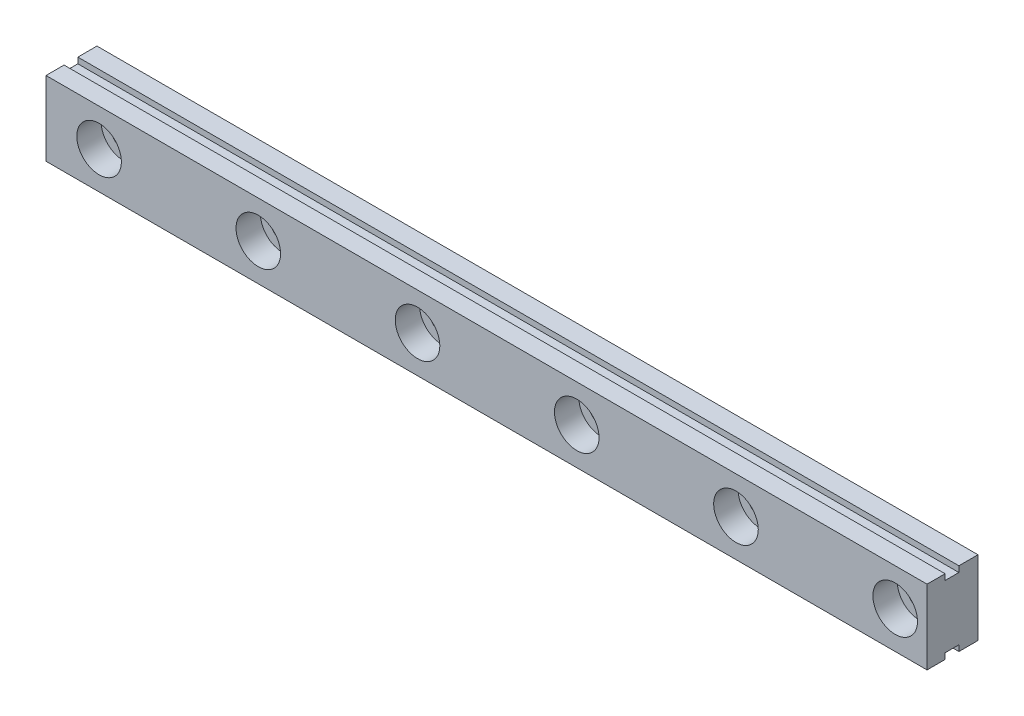
ISO-10303-21;
HEADER;
FILE_DESCRIPTION(('STEP AP214'),'2;1');
FILE_NAME('part.step','',(''),(''),'','','');
FILE_SCHEMA(('AUTOMOTIVE_DESIGN { 1 0 10303 214 1 1 1 1 }'));
ENDSEC;
DATA;
#1=APPLICATION_CONTEXT('core data for automotive mechanical design processes');
#2=APPLICATION_PROTOCOL_DEFINITION('international standard','automotive_design',2000,#1);
#3=PRODUCT_CONTEXT('',#1,'mechanical');
#4=PRODUCT('Part','Part','',(#3));
#5=PRODUCT_RELATED_PRODUCT_CATEGORY('part','',(#4));
#6=PRODUCT_DEFINITION_FORMATION('','',#4);
#7=PRODUCT_DEFINITION_CONTEXT('part definition',#1,'design');
#8=PRODUCT_DEFINITION('design','',#6,#7);
#9=PRODUCT_DEFINITION_SHAPE('','',#8);
#10=(LENGTH_UNIT() NAMED_UNIT(*) SI_UNIT(.MILLI.,.METRE.));
#11=(NAMED_UNIT(*) PLANE_ANGLE_UNIT() SI_UNIT($,.RADIAN.));
#12=(NAMED_UNIT(*) SI_UNIT($,.STERADIAN.) SOLID_ANGLE_UNIT());
#13=UNCERTAINTY_MEASURE_WITH_UNIT(LENGTH_MEASURE(1.E-05),#10,'distance_accuracy_value','');
#14=(GEOMETRIC_REPRESENTATION_CONTEXT(3) GLOBAL_UNCERTAINTY_ASSIGNED_CONTEXT((#13)) GLOBAL_UNIT_ASSIGNED_CONTEXT((#10,
#11,#12)) REPRESENTATION_CONTEXT('',''));
#15=CARTESIAN_POINT('',(0.,0.,0.));
#16=DIRECTION('',(0.,0.,1.));
#17=DIRECTION('',(1.,0.,0.));
#18=AXIS2_PLACEMENT_3D('',#15,#16,#17);
#19=CARTESIAN_POINT('',(83.,22.5,37.2));
#20=DIRECTION('',(0.,-1.,0.));
#21=DIRECTION('',(0.,0.,-1.));
#22=AXIS2_PLACEMENT_3D('',#19,#20,#21);
#23=PLANE('',#22);
#24=DIRECTION('',(0.,0.,1.));
#25=VECTOR('',#24,1.);
#26=CARTESIAN_POINT('',(66.,22.5,27.2));
#27=LINE('',#26,#25);
#28=CARTESIAN_POINT('',(66.,22.5,32.4));
#29=VERTEX_POINT('',#28);
#30=CARTESIAN_POINT('',(66.,22.5,34.2));
#31=VERTEX_POINT('',#30);
#32=EDGE_CURVE('E88',#29,#31,#27,.T.);
#33=ORIENTED_EDGE('',*,*,#32,.F.);
#34=DIRECTION('',(-1.,0.,0.));
#35=VECTOR('',#34,1.);
#36=CARTESIAN_POINT('',(83.,22.5,32.4));
#37=LINE('',#36,#35);
#38=CARTESIAN_POINT('',(-17.,22.5,32.4));
#39=VERTEX_POINT('',#38);
#40=EDGE_CURVE('E79',#29,#39,#37,.T.);
#41=ORIENTED_EDGE('',*,*,#40,.T.);
#42=DIRECTION('',(0.,0.,-1.));
#43=VECTOR('',#42,1.);
#44=CARTESIAN_POINT('',(-17.,22.5,37.2));
#45=LINE('',#44,#43);
#46=CARTESIAN_POINT('',(-17.,22.5,34.2));
#47=VERTEX_POINT('',#46);
#48=EDGE_CURVE('E84',#47,#39,#45,.T.);
#49=ORIENTED_EDGE('',*,*,#48,.F.);
#50=DIRECTION('',(-1.,0.,0.));
#51=VECTOR('',#50,1.);
#52=CARTESIAN_POINT('',(83.,22.5,34.2));
#53=LINE('',#52,#51);
#54=EDGE_CURVE('E122',#31,#47,#53,.T.);
#55=ORIENTED_EDGE('',*,*,#54,.F.);
#56=EDGE_LOOP('',(#33,#41,#49,#55));
#57=FACE_BOUND('',#56,.T.);
#58=ADVANCED_FACE('F41',(#57),#23,.F.);
#59=CARTESIAN_POINT('',(66.,22.5,35.5));
#60=VERTEX_POINT('',#59);
#61=CARTESIAN_POINT('',(66.,22.5,37.2));
#62=VERTEX_POINT('',#61);
#63=EDGE_CURVE('E262',#60,#62,#27,.T.);
#64=ORIENTED_EDGE('',*,*,#63,.F.);
#65=DIRECTION('',(-1.,0.,0.));
#66=VECTOR('',#65,1.);
#67=CARTESIAN_POINT('',(83.,22.5,35.5));
#68=LINE('',#67,#66);
#69=CARTESIAN_POINT('',(-17.,22.5,35.5));
#70=VERTEX_POINT('',#69);
#71=EDGE_CURVE('E47',#60,#70,#68,.T.);
#72=ORIENTED_EDGE('',*,*,#71,.T.);
#73=CARTESIAN_POINT('',(-17.,22.5,37.2));
#74=VERTEX_POINT('',#73);
#75=EDGE_CURVE('E105',#74,#70,#45,.T.);
#76=ORIENTED_EDGE('',*,*,#75,.F.);
#77=DIRECTION('',(-1.,0.,0.));
#78=VECTOR('',#77,1.);
#79=CARTESIAN_POINT('',(83.,22.5,37.2));
#80=LINE('',#79,#78);
#81=EDGE_CURVE('E61',#62,#74,#80,.T.);
#82=ORIENTED_EDGE('',*,*,#81,.F.);
#83=EDGE_LOOP('',(#64,#72,#76,#82));
#84=FACE_BOUND('',#83,.T.);
#85=ADVANCED_FACE('F321',(#84),#23,.F.);
#86=CARTESIAN_POINT('',(63.,19.,37.3));
#87=DIRECTION('',(0.,0.,-1.));
#88=DIRECTION('',(-1.,0.,0.));
#89=AXIS2_PLACEMENT_3D('',#86,#87,#88);
#90=CYLINDRICAL_SURFACE('',#89,1.20000000000001);
#91=CARTESIAN_POINT('',(63.,19.,32.4));
#92=DIRECTION('',(0.,0.,1.));
#93=DIRECTION('',(1.,0.,0.));
#94=AXIS2_PLACEMENT_3D('',#91,#92,#93);
#95=CIRCLE('',#94,1.20000000000001);
#96=CARTESIAN_POINT('',(64.2,19.,32.4));
#97=VERTEX_POINT('',#96);
#98=EDGE_CURVE('E127',#97,#97,#95,.F.);
#99=ORIENTED_EDGE('',*,*,#98,.T.);
#100=EDGE_LOOP('',(#99));
#101=FACE_BOUND('',#100,.T.);
#102=CARTESIAN_POINT('',(63.,19.,34.9));
#103=DIRECTION('',(0.,0.,1.));
#104=DIRECTION('',(1.,0.,0.));
#105=AXIS2_PLACEMENT_3D('',#102,#103,#104);
#106=CIRCLE('',#105,1.20000000000001);
#107=CARTESIAN_POINT('',(64.2,19.,34.9));
#108=VERTEX_POINT('',#107);
#109=EDGE_CURVE('E162',#108,#108,#106,.T.);
#110=ORIENTED_EDGE('',*,*,#109,.T.);
#111=EDGE_LOOP('',(#110));
#112=FACE_BOUND('',#111,.T.);
#113=ADVANCED_FACE('F355',(#101,#112),#90,.F.);
#114=CARTESIAN_POINT('',(48.,19.,37.3));
#115=DIRECTION('',(0.,0.,-1.));
#116=DIRECTION('',(-1.,0.,0.));
#117=AXIS2_PLACEMENT_3D('',#114,#115,#116);
#118=CYLINDRICAL_SURFACE('',#117,1.2);
#119=CARTESIAN_POINT('',(48.,19.,32.4));
#120=DIRECTION('',(0.,0.,1.));
#121=DIRECTION('',(1.,0.,0.));
#122=AXIS2_PLACEMENT_3D('',#119,#120,#121);
#123=CIRCLE('',#122,1.2);
#124=CARTESIAN_POINT('',(49.2,19.,32.4));
#125=VERTEX_POINT('',#124);
#126=EDGE_CURVE('E126',#125,#125,#123,.F.);
#127=ORIENTED_EDGE('',*,*,#126,.T.);
#128=EDGE_LOOP('',(#127));
#129=FACE_BOUND('',#128,.T.);
#130=CARTESIAN_POINT('',(48.,19.,34.9));
#131=DIRECTION('',(0.,0.,1.));
#132=DIRECTION('',(1.,0.,0.));
#133=AXIS2_PLACEMENT_3D('',#130,#131,#132);
#134=CIRCLE('',#133,1.2);
#135=CARTESIAN_POINT('',(49.2,19.,34.9));
#136=VERTEX_POINT('',#135);
#137=EDGE_CURVE('E159',#136,#136,#134,.T.);
#138=ORIENTED_EDGE('',*,*,#137,.T.);
#139=EDGE_LOOP('',(#138));
#140=FACE_BOUND('',#139,.T.);
#141=ADVANCED_FACE('F383',(#129,#140),#118,.F.);
#142=CARTESIAN_POINT('',(33.,19.,37.3));
#143=DIRECTION('',(0.,0.,-1.));
#144=DIRECTION('',(-1.,0.,0.));
#145=AXIS2_PLACEMENT_3D('',#142,#143,#144);
#146=CYLINDRICAL_SURFACE('',#145,1.2);
#147=CARTESIAN_POINT('',(33.,19.,32.4));
#148=DIRECTION('',(0.,0.,1.));
#149=DIRECTION('',(1.,0.,0.));
#150=AXIS2_PLACEMENT_3D('',#147,#148,#149);
#151=CIRCLE('',#150,1.2);
#152=CARTESIAN_POINT('',(34.2,19.,32.4));
#153=VERTEX_POINT('',#152);
#154=EDGE_CURVE('E132',#153,#153,#151,.F.);
#155=ORIENTED_EDGE('',*,*,#154,.T.);
#156=EDGE_LOOP('',(#155));
#157=FACE_BOUND('',#156,.T.);
#158=CARTESIAN_POINT('',(33.,19.,34.9));
#159=DIRECTION('',(0.,0.,1.));
#160=DIRECTION('',(1.,0.,0.));
#161=AXIS2_PLACEMENT_3D('',#158,#159,#160);
#162=CIRCLE('',#161,1.2);
#163=CARTESIAN_POINT('',(34.2,19.,34.9));
#164=VERTEX_POINT('',#163);
#165=EDGE_CURVE('E157',#164,#164,#162,.T.);
#166=ORIENTED_EDGE('',*,*,#165,.T.);
#167=EDGE_LOOP('',(#166));
#168=FACE_BOUND('',#167,.T.);
#169=ADVANCED_FACE('F382',(#157,#168),#146,.F.);
#170=CARTESIAN_POINT('',(18.,19.,37.3));
#171=DIRECTION('',(0.,0.,-1.));
#172=DIRECTION('',(-1.,0.,0.));
#173=AXIS2_PLACEMENT_3D('',#170,#171,#172);
#174=CYLINDRICAL_SURFACE('',#173,1.2);
#175=CARTESIAN_POINT('',(18.,19.,32.4));
#176=DIRECTION('',(0.,0.,1.));
#177=DIRECTION('',(1.,0.,0.));
#178=AXIS2_PLACEMENT_3D('',#175,#176,#177);
#179=CIRCLE('',#178,1.2);
#180=CARTESIAN_POINT('',(19.2,19.,32.4));
#181=VERTEX_POINT('',#180);
#182=EDGE_CURVE('E137',#181,#181,#179,.F.);
#183=ORIENTED_EDGE('',*,*,#182,.T.);
#184=EDGE_LOOP('',(#183));
#185=FACE_BOUND('',#184,.T.);
#186=CARTESIAN_POINT('',(18.,19.,34.9));
#187=DIRECTION('',(0.,0.,1.));
#188=DIRECTION('',(1.,0.,0.));
#189=AXIS2_PLACEMENT_3D('',#186,#187,#188);
#190=CIRCLE('',#189,1.2);
#191=CARTESIAN_POINT('',(19.2,19.,34.9));
#192=VERTEX_POINT('',#191);
#193=EDGE_CURVE('E152',#192,#192,#190,.T.);
#194=ORIENTED_EDGE('',*,*,#193,.T.);
#195=EDGE_LOOP('',(#194));
#196=FACE_BOUND('',#195,.T.);
#197=ADVANCED_FACE('F371',(#185,#196),#174,.F.);
#198=CARTESIAN_POINT('',(3.,19.,37.3));
#199=DIRECTION('',(0.,0.,-1.));
#200=DIRECTION('',(-1.,0.,0.));
#201=AXIS2_PLACEMENT_3D('',#198,#199,#200);
#202=CYLINDRICAL_SURFACE('',#201,1.2);
#203=CARTESIAN_POINT('',(3.,19.,32.4));
#204=DIRECTION('',(0.,0.,1.));
#205=DIRECTION('',(1.,0.,0.));
#206=AXIS2_PLACEMENT_3D('',#203,#204,#205);
#207=CIRCLE('',#206,1.2);
#208=CARTESIAN_POINT('',(4.2,19.,32.4));
#209=VERTEX_POINT('',#208);
#210=EDGE_CURVE('E139',#209,#209,#207,.F.);
#211=ORIENTED_EDGE('',*,*,#210,.T.);
#212=EDGE_LOOP('',(#211));
#213=FACE_BOUND('',#212,.T.);
#214=CARTESIAN_POINT('',(3.,19.,34.9));
#215=DIRECTION('',(0.,0.,1.));
#216=DIRECTION('',(1.,0.,0.));
#217=AXIS2_PLACEMENT_3D('',#214,#215,#216);
#218=CIRCLE('',#217,1.2);
#219=CARTESIAN_POINT('',(4.2,19.,34.9));
#220=VERTEX_POINT('',#219);
#221=EDGE_CURVE('E146',#220,#220,#218,.T.);
#222=ORIENTED_EDGE('',*,*,#221,.T.);
#223=EDGE_LOOP('',(#222));
#224=FACE_BOUND('',#223,.T.);
#225=ADVANCED_FACE('F362',(#213,#224),#202,.F.);
#226=CARTESIAN_POINT('',(-12.,19.,37.3));
#227=DIRECTION('',(0.,0.,-1.));
#228=DIRECTION('',(-1.,0.,0.));
#229=AXIS2_PLACEMENT_3D('',#226,#227,#228);
#230=CYLINDRICAL_SURFACE('',#229,1.2);
#231=CARTESIAN_POINT('',(-12.,19.,32.4));
#232=DIRECTION('',(0.,0.,1.));
#233=DIRECTION('',(1.,0.,0.));
#234=AXIS2_PLACEMENT_3D('',#231,#232,#233);
#235=CIRCLE('',#234,1.2);
#236=CARTESIAN_POINT('',(-10.8,19.,32.4));
#237=VERTEX_POINT('',#236);
#238=EDGE_CURVE('E145',#237,#237,#235,.F.);
#239=ORIENTED_EDGE('',*,*,#238,.T.);
#240=EDGE_LOOP('',(#239));
#241=FACE_BOUND('',#240,.T.);
#242=CARTESIAN_POINT('',(-12.,19.,34.9));
#243=DIRECTION('',(0.,0.,1.));
#244=DIRECTION('',(1.,0.,0.));
#245=AXIS2_PLACEMENT_3D('',#242,#243,#244);
#246=CIRCLE('',#245,1.2);
#247=CARTESIAN_POINT('',(-10.8,19.,34.9));
#248=VERTEX_POINT('',#247);
#249=EDGE_CURVE('E147',#248,#248,#246,.T.);
#250=ORIENTED_EDGE('',*,*,#249,.T.);
#251=EDGE_LOOP('',(#250));
#252=FACE_BOUND('',#251,.T.);
#253=ADVANCED_FACE('F363',(#241,#252),#230,.F.);
#254=CARTESIAN_POINT('',(-17.,15.5,37.2));
#255=DIRECTION('',(0.,1.,0.));
#256=DIRECTION('',(0.,0.,1.));
#257=AXIS2_PLACEMENT_3D('',#254,#255,#256);
#258=PLANE('',#257);
#259=DIRECTION('',(1.,0.,0.));
#260=VECTOR('',#259,1.);
#261=CARTESIAN_POINT('',(-17.,15.5,32.4));
#262=LINE('',#261,#260);
#263=CARTESIAN_POINT('',(-17.,15.5,32.4));
#264=VERTEX_POINT('',#263);
#265=CARTESIAN_POINT('',(66.,15.5,32.4));
#266=VERTEX_POINT('',#265);
#267=EDGE_CURVE('E92',#264,#266,#262,.T.);
#268=ORIENTED_EDGE('',*,*,#267,.T.);
#269=DIRECTION('',(0.,0.,1.));
#270=VECTOR('',#269,1.);
#271=CARTESIAN_POINT('',(66.,15.5,27.2));
#272=LINE('',#271,#270);
#273=CARTESIAN_POINT('',(66.,15.5,34.2));
#274=VERTEX_POINT('',#273);
#275=EDGE_CURVE('E258',#266,#274,#272,.T.);
#276=ORIENTED_EDGE('',*,*,#275,.T.);
#277=DIRECTION('',(1.,0.,0.));
#278=VECTOR('',#277,1.);
#279=CARTESIAN_POINT('',(-17.,15.5,34.2));
#280=LINE('',#279,#278);
#281=CARTESIAN_POINT('',(-17.,15.5,34.2));
#282=VERTEX_POINT('',#281);
#283=EDGE_CURVE('E235',#282,#274,#280,.T.);
#284=ORIENTED_EDGE('',*,*,#283,.F.);
#285=DIRECTION('',(0.,0.,-1.));
#286=VECTOR('',#285,1.);
#287=CARTESIAN_POINT('',(-17.,15.5,37.2));
#288=LINE('',#287,#286);
#289=EDGE_CURVE('E120',#282,#264,#288,.T.);
#290=ORIENTED_EDGE('',*,*,#289,.T.);
#291=EDGE_LOOP('',(#268,#276,#284,#290));
#292=FACE_BOUND('',#291,.T.);
#293=ADVANCED_FACE('F286',(#292),#258,.F.);
#294=CARTESIAN_POINT('',(-17.,22.5,37.2));
#295=DIRECTION('',(1.,0.,0.));
#296=DIRECTION('',(0.,0.,-1.));
#297=AXIS2_PLACEMENT_3D('',#294,#295,#296);
#298=PLANE('',#297);
#299=DIRECTION('',(0.,0.,-1.));
#300=VECTOR('',#299,1.);
#301=CARTESIAN_POINT('',(-17.,16.05,37.2));
#302=LINE('',#301,#300);
#303=CARTESIAN_POINT('',(-17.,16.05,35.5));
#304=VERTEX_POINT('',#303);
#305=CARTESIAN_POINT('',(-17.,16.05,34.2));
#306=VERTEX_POINT('',#305);
#307=EDGE_CURVE('E110',#304,#306,#302,.T.);
#308=ORIENTED_EDGE('',*,*,#307,.F.);
#309=DIRECTION('',(0.,-1.,0.));
#310=VECTOR('',#309,1.);
#311=CARTESIAN_POINT('',(-17.,22.5,35.5));
#312=LINE('',#311,#310);
#313=CARTESIAN_POINT('',(-17.,15.5,35.5));
#314=VERTEX_POINT('',#313);
#315=EDGE_CURVE('E111',#304,#314,#312,.T.);
#316=ORIENTED_EDGE('',*,*,#315,.T.);
#317=CARTESIAN_POINT('',(-17.,15.5,37.2));
#318=VERTEX_POINT('',#317);
#319=EDGE_CURVE('E117',#318,#314,#288,.T.);
#320=ORIENTED_EDGE('',*,*,#319,.F.);
#321=DIRECTION('',(0.,-1.,0.));
#322=VECTOR('',#321,1.);
#323=CARTESIAN_POINT('',(-17.,22.5,37.2));
#324=LINE('',#323,#322);
#325=EDGE_CURVE('E86',#74,#318,#324,.T.);
#326=ORIENTED_EDGE('',*,*,#325,.F.);
#327=ORIENTED_EDGE('',*,*,#75,.T.);
#328=DIRECTION('',(0.,-1.,0.));
#329=VECTOR('',#328,1.);
#330=CARTESIAN_POINT('',(-17.,22.5,35.5));
#331=LINE('',#330,#329);
#332=CARTESIAN_POINT('',(-17.,21.95,35.5));
#333=VERTEX_POINT('',#332);
#334=EDGE_CURVE('E228',#70,#333,#331,.T.);
#335=ORIENTED_EDGE('',*,*,#334,.T.);
#336=DIRECTION('',(0.,0.,1.));
#337=VECTOR('',#336,1.);
#338=CARTESIAN_POINT('',(-17.,21.95,37.2));
#339=LINE('',#338,#337);
#340=CARTESIAN_POINT('',(-17.,21.95,34.2));
#341=VERTEX_POINT('',#340);
#342=EDGE_CURVE('E230',#341,#333,#339,.T.);
#343=ORIENTED_EDGE('',*,*,#342,.F.);
#344=DIRECTION('',(0.,-1.,0.));
#345=VECTOR('',#344,1.);
#346=CARTESIAN_POINT('',(-17.,22.5,34.2));
#347=LINE('',#346,#345);
#348=EDGE_CURVE('E103',#47,#341,#347,.T.);
#349=ORIENTED_EDGE('',*,*,#348,.F.);
#350=ORIENTED_EDGE('',*,*,#48,.T.);
#351=DIRECTION('',(0.,-1.,0.));
#352=VECTOR('',#351,1.);
#353=CARTESIAN_POINT('',(-17.,22.5,32.4));
#354=LINE('',#353,#352);
#355=EDGE_CURVE('E96',#39,#264,#354,.T.);
#356=ORIENTED_EDGE('',*,*,#355,.T.);
#357=ORIENTED_EDGE('',*,*,#289,.F.);
#358=DIRECTION('',(0.,-1.,0.));
#359=VECTOR('',#358,1.);
#360=CARTESIAN_POINT('',(-17.,22.5,34.2));
#361=LINE('',#360,#359);
#362=EDGE_CURVE('E232',#306,#282,#361,.T.);
#363=ORIENTED_EDGE('',*,*,#362,.F.);
#364=EDGE_LOOP('',(#308,#316,#320,#326,#327,#335,#343,#349,#350,#356,#357,#363));
#365=FACE_BOUND('',#364,.T.);
#366=ADVANCED_FACE('F43',(#365),#298,.F.);
#367=DIRECTION('',(1.,0.,0.));
#368=VECTOR('',#367,1.);
#369=CARTESIAN_POINT('',(-17.,15.5,35.5));
#370=LINE('',#369,#368);
#371=CARTESIAN_POINT('',(66.,15.5,35.5));
#372=VERTEX_POINT('',#371);
#373=EDGE_CURVE('E238',#314,#372,#370,.T.);
#374=ORIENTED_EDGE('',*,*,#373,.T.);
#375=CARTESIAN_POINT('',(66.,15.5,37.2));
#376=VERTEX_POINT('',#375);
#377=EDGE_CURVE('E257',#372,#376,#272,.T.);
#378=ORIENTED_EDGE('',*,*,#377,.T.);
#379=DIRECTION('',(1.,0.,0.));
#380=VECTOR('',#379,1.);
#381=CARTESIAN_POINT('',(-17.,15.5,37.2));
#382=LINE('',#381,#380);
#383=EDGE_CURVE('E243',#318,#376,#382,.T.);
#384=ORIENTED_EDGE('',*,*,#383,.F.);
#385=ORIENTED_EDGE('',*,*,#319,.T.);
#386=EDGE_LOOP('',(#374,#378,#384,#385));
#387=FACE_BOUND('',#386,.T.);
#388=ADVANCED_FACE('F251',(#387),#258,.F.);
#389=CARTESIAN_POINT('',(0.,0.,37.2));
#390=DIRECTION('',(0.,0.,1.));
#391=DIRECTION('',(1.,0.,0.));
#392=AXIS2_PLACEMENT_3D('',#389,#390,#391);
#393=PLANE('',#392);
#394=DIRECTION('',(0.,-1.,0.));
#395=VECTOR('',#394,1.);
#396=CARTESIAN_POINT('',(66.,22.5,37.2));
#397=LINE('',#396,#395);
#398=EDGE_CURVE('E247',#62,#376,#397,.T.);
#399=ORIENTED_EDGE('',*,*,#398,.F.);
#400=ORIENTED_EDGE('',*,*,#81,.T.);
#401=ORIENTED_EDGE('',*,*,#325,.T.);
#402=ORIENTED_EDGE('',*,*,#383,.T.);
#403=EDGE_LOOP('',(#399,#400,#401,#402));
#404=FACE_BOUND('',#403,.T.);
#405=CARTESIAN_POINT('',(-12.,19.,37.2));
#406=DIRECTION('',(0.,0.,1.));
#407=DIRECTION('',(1.,0.,0.));
#408=AXIS2_PLACEMENT_3D('',#405,#406,#407);
#409=CIRCLE('',#408,2.1);
#410=CARTESIAN_POINT('',(-9.9,19.,37.2));
#411=VERTEX_POINT('',#410);
#412=EDGE_CURVE('E128',#411,#411,#409,.F.);
#413=ORIENTED_EDGE('',*,*,#412,.T.);
#414=EDGE_LOOP('',(#413));
#415=FACE_BOUND('',#414,.T.);
#416=CARTESIAN_POINT('',(3.,19.,37.2));
#417=DIRECTION('',(0.,0.,1.));
#418=DIRECTION('',(1.,0.,0.));
#419=AXIS2_PLACEMENT_3D('',#416,#417,#418);
#420=CIRCLE('',#419,2.1);
#421=CARTESIAN_POINT('',(5.1,19.,37.2));
#422=VERTEX_POINT('',#421);
#423=EDGE_CURVE('E180',#422,#422,#420,.F.);
#424=ORIENTED_EDGE('',*,*,#423,.T.);
#425=EDGE_LOOP('',(#424));
#426=FACE_BOUND('',#425,.T.);
#427=CARTESIAN_POINT('',(18.,19.,37.2));
#428=DIRECTION('',(0.,0.,1.));
#429=DIRECTION('',(1.,0.,0.));
#430=AXIS2_PLACEMENT_3D('',#427,#428,#429);
#431=CIRCLE('',#430,2.1);
#432=CARTESIAN_POINT('',(20.1,19.,37.2));
#433=VERTEX_POINT('',#432);
#434=EDGE_CURVE('E172',#433,#433,#431,.F.);
#435=ORIENTED_EDGE('',*,*,#434,.T.);
#436=EDGE_LOOP('',(#435));
#437=FACE_BOUND('',#436,.T.);
#438=CARTESIAN_POINT('',(33.,19.,37.2));
#439=DIRECTION('',(0.,0.,1.));
#440=DIRECTION('',(1.,0.,0.));
#441=AXIS2_PLACEMENT_3D('',#438,#439,#440);
#442=CIRCLE('',#441,2.1);
#443=CARTESIAN_POINT('',(35.1,19.,37.2));
#444=VERTEX_POINT('',#443);
#445=EDGE_CURVE('E171',#444,#444,#442,.F.);
#446=ORIENTED_EDGE('',*,*,#445,.T.);
#447=EDGE_LOOP('',(#446));
#448=FACE_BOUND('',#447,.T.);
#449=CARTESIAN_POINT('',(48.,19.,37.2));
#450=DIRECTION('',(0.,0.,1.));
#451=DIRECTION('',(1.,0.,0.));
#452=AXIS2_PLACEMENT_3D('',#449,#450,#451);
#453=CIRCLE('',#452,2.1);
#454=CARTESIAN_POINT('',(50.1,19.,37.2));
#455=VERTEX_POINT('',#454);
#456=EDGE_CURVE('E166',#455,#455,#453,.F.);
#457=ORIENTED_EDGE('',*,*,#456,.T.);
#458=EDGE_LOOP('',(#457));
#459=FACE_BOUND('',#458,.T.);
#460=CARTESIAN_POINT('',(63.,19.,37.2));
#461=DIRECTION('',(0.,0.,1.));
#462=DIRECTION('',(1.,0.,0.));
#463=AXIS2_PLACEMENT_3D('',#460,#461,#462);
#464=CIRCLE('',#463,2.1);
#465=CARTESIAN_POINT('',(65.1,19.,37.2));
#466=VERTEX_POINT('',#465);
#467=EDGE_CURVE('E164',#466,#466,#464,.F.);
#468=ORIENTED_EDGE('',*,*,#467,.T.);
#469=EDGE_LOOP('',(#468));
#470=FACE_BOUND('',#469,.T.);
#471=ADVANCED_FACE('F185',(#404,#415,#426,#437,#448,#459,#470),#393,.T.);
#472=CARTESIAN_POINT('',(0.,0.,32.4));
#473=DIRECTION('',(0.,0.,1.));
#474=DIRECTION('',(1.,0.,0.));
#475=AXIS2_PLACEMENT_3D('',#472,#473,#474);
#476=PLANE('',#475);
#477=ORIENTED_EDGE('',*,*,#238,.F.);
#478=EDGE_LOOP('',(#477));
#479=FACE_BOUND('',#478,.T.);
#480=ORIENTED_EDGE('',*,*,#210,.F.);
#481=EDGE_LOOP('',(#480));
#482=FACE_BOUND('',#481,.T.);
#483=ORIENTED_EDGE('',*,*,#182,.F.);
#484=EDGE_LOOP('',(#483));
#485=FACE_BOUND('',#484,.T.);
#486=ORIENTED_EDGE('',*,*,#154,.F.);
#487=EDGE_LOOP('',(#486));
#488=FACE_BOUND('',#487,.T.);
#489=ORIENTED_EDGE('',*,*,#126,.F.);
#490=EDGE_LOOP('',(#489));
#491=FACE_BOUND('',#490,.T.);
#492=ORIENTED_EDGE('',*,*,#98,.F.);
#493=EDGE_LOOP('',(#492));
#494=FACE_BOUND('',#493,.T.);
#495=ORIENTED_EDGE('',*,*,#40,.F.);
#496=DIRECTION('',(0.,-1.,0.));
#497=VECTOR('',#496,1.);
#498=CARTESIAN_POINT('',(66.,0.,32.4));
#499=LINE('',#498,#497);
#500=EDGE_CURVE('E196',#29,#266,#499,.T.);
#501=ORIENTED_EDGE('',*,*,#500,.T.);
#502=ORIENTED_EDGE('',*,*,#267,.F.);
#503=ORIENTED_EDGE('',*,*,#355,.F.);
#504=EDGE_LOOP('',(#495,#501,#502,#503));
#505=FACE_BOUND('',#504,.T.);
#506=ADVANCED_FACE('F102',(#479,#482,#485,#488,#491,#494,#505),#476,.F.);
#507=CARTESIAN_POINT('',(-17.1,21.95,35.5));
#508=DIRECTION('',(0.,1.,0.));
#509=DIRECTION('',(0.,0.,1.));
#510=AXIS2_PLACEMENT_3D('',#507,#508,#509);
#511=PLANE('',#510);
#512=DIRECTION('',(0.,0.,1.));
#513=VECTOR('',#512,1.);
#514=CARTESIAN_POINT('',(66.,21.95,35.5));
#515=LINE('',#514,#513);
#516=CARTESIAN_POINT('',(66.,21.95,34.2));
#517=VERTEX_POINT('',#516);
#518=CARTESIAN_POINT('',(66.,21.95,35.5));
#519=VERTEX_POINT('',#518);
#520=EDGE_CURVE('E274',#517,#519,#515,.T.);
#521=ORIENTED_EDGE('',*,*,#520,.F.);
#522=DIRECTION('',(1.,0.,0.));
#523=VECTOR('',#522,1.);
#524=CARTESIAN_POINT('',(-17.1,21.95,34.2));
#525=LINE('',#524,#523);
#526=EDGE_CURVE('E216',#341,#517,#525,.T.);
#527=ORIENTED_EDGE('',*,*,#526,.F.);
#528=ORIENTED_EDGE('',*,*,#342,.T.);
#529=DIRECTION('',(1.,0.,0.));
#530=VECTOR('',#529,1.);
#531=CARTESIAN_POINT('',(-17.1,21.95,35.5));
#532=LINE('',#531,#530);
#533=EDGE_CURVE('E143',#333,#519,#532,.T.);
#534=ORIENTED_EDGE('',*,*,#533,.T.);
#535=EDGE_LOOP('',(#521,#527,#528,#534));
#536=FACE_BOUND('',#535,.T.);
#537=ADVANCED_FACE('F330',(#536),#511,.T.);
#538=CARTESIAN_POINT('',(0.,0.,35.5));
#539=DIRECTION('',(0.,0.,1.));
#540=DIRECTION('',(1.,0.,0.));
#541=AXIS2_PLACEMENT_3D('',#538,#539,#540);
#542=PLANE('',#541);
#543=ORIENTED_EDGE('',*,*,#71,.F.);
#544=DIRECTION('',(0.,-1.,0.));
#545=VECTOR('',#544,1.);
#546=CARTESIAN_POINT('',(66.,0.,35.5));
#547=LINE('',#546,#545);
#548=EDGE_CURVE('E277',#60,#519,#547,.T.);
#549=ORIENTED_EDGE('',*,*,#548,.T.);
#550=ORIENTED_EDGE('',*,*,#533,.F.);
#551=ORIENTED_EDGE('',*,*,#334,.F.);
#552=EDGE_LOOP('',(#543,#549,#550,#551));
#553=FACE_BOUND('',#552,.T.);
#554=ADVANCED_FACE('F323',(#553),#542,.F.);
#555=CARTESIAN_POINT('',(0.,0.,34.2));
#556=DIRECTION('',(0.,0.,1.));
#557=DIRECTION('',(1.,0.,0.));
#558=AXIS2_PLACEMENT_3D('',#555,#556,#557);
#559=PLANE('',#558);
#560=DIRECTION('',(0.,-1.,0.));
#561=VECTOR('',#560,1.);
#562=CARTESIAN_POINT('',(66.,0.,34.2));
#563=LINE('',#562,#561);
#564=EDGE_CURVE('E272',#31,#517,#563,.T.);
#565=ORIENTED_EDGE('',*,*,#564,.F.);
#566=ORIENTED_EDGE('',*,*,#54,.T.);
#567=ORIENTED_EDGE('',*,*,#348,.T.);
#568=ORIENTED_EDGE('',*,*,#526,.T.);
#569=EDGE_LOOP('',(#565,#566,#567,#568));
#570=FACE_BOUND('',#569,.T.);
#571=ADVANCED_FACE('F335',(#570),#559,.T.);
#572=CARTESIAN_POINT('',(83.1,16.05,35.5));
#573=DIRECTION('',(0.,-1.,0.));
#574=DIRECTION('',(0.,0.,-1.));
#575=AXIS2_PLACEMENT_3D('',#572,#573,#574);
#576=PLANE('',#575);
#577=DIRECTION('',(0.,0.,-1.));
#578=VECTOR('',#577,1.);
#579=CARTESIAN_POINT('',(66.,16.05,35.5));
#580=LINE('',#579,#578);
#581=CARTESIAN_POINT('',(66.,16.05,35.5));
#582=VERTEX_POINT('',#581);
#583=CARTESIAN_POINT('',(66.,16.05,34.2));
#584=VERTEX_POINT('',#583);
#585=EDGE_CURVE('E54',#582,#584,#580,.T.);
#586=ORIENTED_EDGE('',*,*,#585,.F.);
#587=DIRECTION('',(-1.,0.,0.));
#588=VECTOR('',#587,1.);
#589=CARTESIAN_POINT('',(83.1,16.05,35.5));
#590=LINE('',#589,#588);
#591=EDGE_CURVE('E211',#582,#304,#590,.T.);
#592=ORIENTED_EDGE('',*,*,#591,.T.);
#593=ORIENTED_EDGE('',*,*,#307,.T.);
#594=DIRECTION('',(-1.,0.,0.));
#595=VECTOR('',#594,1.);
#596=CARTESIAN_POINT('',(83.1,16.05,34.2));
#597=LINE('',#596,#595);
#598=EDGE_CURVE('E219',#584,#306,#597,.T.);
#599=ORIENTED_EDGE('',*,*,#598,.F.);
#600=EDGE_LOOP('',(#586,#592,#593,#599));
#601=FACE_BOUND('',#600,.T.);
#602=ADVANCED_FACE('F308',(#601),#576,.T.);
#603=CARTESIAN_POINT('',(0.,0.,35.5));
#604=DIRECTION('',(0.,0.,1.));
#605=DIRECTION('',(1.,0.,0.));
#606=AXIS2_PLACEMENT_3D('',#603,#604,#605);
#607=PLANE('',#606);
#608=ORIENTED_EDGE('',*,*,#591,.F.);
#609=DIRECTION('',(0.,-1.,0.));
#610=VECTOR('',#609,1.);
#611=CARTESIAN_POINT('',(66.,0.,35.5));
#612=LINE('',#611,#610);
#613=EDGE_CURVE('E269',#582,#372,#612,.T.);
#614=ORIENTED_EDGE('',*,*,#613,.T.);
#615=ORIENTED_EDGE('',*,*,#373,.F.);
#616=ORIENTED_EDGE('',*,*,#315,.F.);
#617=EDGE_LOOP('',(#608,#614,#615,#616));
#618=FACE_BOUND('',#617,.T.);
#619=ADVANCED_FACE('F304',(#618),#607,.F.);
#620=CARTESIAN_POINT('',(0.,0.,34.2));
#621=DIRECTION('',(0.,0.,1.));
#622=DIRECTION('',(1.,0.,0.));
#623=AXIS2_PLACEMENT_3D('',#620,#621,#622);
#624=PLANE('',#623);
#625=DIRECTION('',(0.,-1.,0.));
#626=VECTOR('',#625,1.);
#627=CARTESIAN_POINT('',(66.,0.,34.2));
#628=LINE('',#627,#626);
#629=EDGE_CURVE('E11',#584,#274,#628,.T.);
#630=ORIENTED_EDGE('',*,*,#629,.F.);
#631=ORIENTED_EDGE('',*,*,#598,.T.);
#632=ORIENTED_EDGE('',*,*,#362,.T.);
#633=ORIENTED_EDGE('',*,*,#283,.T.);
#634=EDGE_LOOP('',(#630,#631,#632,#633));
#635=FACE_BOUND('',#634,.T.);
#636=ADVANCED_FACE('F186',(#635),#624,.T.);
#637=CARTESIAN_POINT('',(-12.,19.,37.3));
#638=DIRECTION('',(0.,0.,-1.));
#639=DIRECTION('',(-1.,0.,0.));
#640=AXIS2_PLACEMENT_3D('',#637,#638,#639);
#641=CYLINDRICAL_SURFACE('',#640,2.1);
#642=ORIENTED_EDGE('',*,*,#412,.F.);
#643=EDGE_LOOP('',(#642));
#644=FACE_BOUND('',#643,.T.);
#645=CARTESIAN_POINT('',(-12.,19.,34.9));
#646=DIRECTION('',(0.,0.,1.));
#647=DIRECTION('',(1.,0.,0.));
#648=AXIS2_PLACEMENT_3D('',#645,#646,#647);
#649=CIRCLE('',#648,2.1);
#650=CARTESIAN_POINT('',(-9.9,19.,34.9));
#651=VERTEX_POINT('',#650);
#652=EDGE_CURVE('E148',#651,#651,#649,.T.);
#653=ORIENTED_EDGE('',*,*,#652,.F.);
#654=EDGE_LOOP('',(#653));
#655=FACE_BOUND('',#654,.T.);
#656=ADVANCED_FACE('F184',(#644,#655),#641,.F.);
#657=CARTESIAN_POINT('',(-12.,19.,34.9));
#658=DIRECTION('',(0.,0.,1.));
#659=DIRECTION('',(1.,0.,0.));
#660=AXIS2_PLACEMENT_3D('',#657,#658,#659);
#661=PLANE('',#660);
#662=ORIENTED_EDGE('',*,*,#249,.F.);
#663=EDGE_LOOP('',(#662));
#664=FACE_BOUND('',#663,.T.);
#665=ORIENTED_EDGE('',*,*,#652,.T.);
#666=EDGE_LOOP('',(#665));
#667=FACE_BOUND('',#666,.T.);
#668=ADVANCED_FACE('F189',(#664,#667),#661,.T.);
#669=CARTESIAN_POINT('',(3.,19.,37.3));
#670=DIRECTION('',(0.,0.,-1.));
#671=DIRECTION('',(-1.,0.,0.));
#672=AXIS2_PLACEMENT_3D('',#669,#670,#671);
#673=CYLINDRICAL_SURFACE('',#672,2.1);
#674=ORIENTED_EDGE('',*,*,#423,.F.);
#675=EDGE_LOOP('',(#674));
#676=FACE_BOUND('',#675,.T.);
#677=CARTESIAN_POINT('',(3.,19.,34.9));
#678=DIRECTION('',(0.,0.,1.));
#679=DIRECTION('',(1.,0.,0.));
#680=AXIS2_PLACEMENT_3D('',#677,#678,#679);
#681=CIRCLE('',#680,2.1);
#682=CARTESIAN_POINT('',(5.1,19.,34.9));
#683=VERTEX_POINT('',#682);
#684=EDGE_CURVE('E191',#683,#683,#681,.T.);
#685=ORIENTED_EDGE('',*,*,#684,.F.);
#686=EDGE_LOOP('',(#685));
#687=FACE_BOUND('',#686,.T.);
#688=ADVANCED_FACE('F434',(#676,#687),#673,.F.);
#689=CARTESIAN_POINT('',(3.,19.,34.9));
#690=DIRECTION('',(0.,0.,1.));
#691=DIRECTION('',(1.,0.,0.));
#692=AXIS2_PLACEMENT_3D('',#689,#690,#691);
#693=PLANE('',#692);
#694=ORIENTED_EDGE('',*,*,#221,.F.);
#695=EDGE_LOOP('',(#694));
#696=FACE_BOUND('',#695,.T.);
#697=ORIENTED_EDGE('',*,*,#684,.T.);
#698=EDGE_LOOP('',(#697));
#699=FACE_BOUND('',#698,.T.);
#700=ADVANCED_FACE('F431',(#696,#699),#693,.T.);
#701=CARTESIAN_POINT('',(18.,19.,37.3));
#702=DIRECTION('',(0.,0.,-1.));
#703=DIRECTION('',(-1.,0.,0.));
#704=AXIS2_PLACEMENT_3D('',#701,#702,#703);
#705=CYLINDRICAL_SURFACE('',#704,2.1);
#706=ORIENTED_EDGE('',*,*,#434,.F.);
#707=EDGE_LOOP('',(#706));
#708=FACE_BOUND('',#707,.T.);
#709=CARTESIAN_POINT('',(18.,19.,34.9));
#710=DIRECTION('',(0.,0.,1.));
#711=DIRECTION('',(1.,0.,0.));
#712=AXIS2_PLACEMENT_3D('',#709,#710,#711);
#713=CIRCLE('',#712,2.1);
#714=CARTESIAN_POINT('',(20.1,19.,34.9));
#715=VERTEX_POINT('',#714);
#716=EDGE_CURVE('E199',#715,#715,#713,.T.);
#717=ORIENTED_EDGE('',*,*,#716,.F.);
#718=EDGE_LOOP('',(#717));
#719=FACE_BOUND('',#718,.T.);
#720=ADVANCED_FACE('F430',(#708,#719),#705,.F.);
#721=CARTESIAN_POINT('',(18.,19.,34.9));
#722=DIRECTION('',(0.,0.,1.));
#723=DIRECTION('',(1.,0.,0.));
#724=AXIS2_PLACEMENT_3D('',#721,#722,#723);
#725=PLANE('',#724);
#726=ORIENTED_EDGE('',*,*,#193,.F.);
#727=EDGE_LOOP('',(#726));
#728=FACE_BOUND('',#727,.T.);
#729=ORIENTED_EDGE('',*,*,#716,.T.);
#730=EDGE_LOOP('',(#729));
#731=FACE_BOUND('',#730,.T.);
#732=ADVANCED_FACE('F421',(#728,#731),#725,.T.);
#733=CARTESIAN_POINT('',(33.,19.,37.3));
#734=DIRECTION('',(0.,0.,-1.));
#735=DIRECTION('',(-1.,0.,0.));
#736=AXIS2_PLACEMENT_3D('',#733,#734,#735);
#737=CYLINDRICAL_SURFACE('',#736,2.1);
#738=ORIENTED_EDGE('',*,*,#445,.F.);
#739=EDGE_LOOP('',(#738));
#740=FACE_BOUND('',#739,.T.);
#741=CARTESIAN_POINT('',(33.,19.,34.9));
#742=DIRECTION('',(0.,0.,1.));
#743=DIRECTION('',(1.,0.,0.));
#744=AXIS2_PLACEMENT_3D('',#741,#742,#743);
#745=CIRCLE('',#744,2.1);
#746=CARTESIAN_POINT('',(35.1,19.,34.9));
#747=VERTEX_POINT('',#746);
#748=EDGE_CURVE('E201',#747,#747,#745,.T.);
#749=ORIENTED_EDGE('',*,*,#748,.F.);
#750=EDGE_LOOP('',(#749));
#751=FACE_BOUND('',#750,.T.);
#752=ADVANCED_FACE('F419',(#740,#751),#737,.F.);
#753=CARTESIAN_POINT('',(33.,19.,34.9));
#754=DIRECTION('',(0.,0.,1.));
#755=DIRECTION('',(1.,0.,0.));
#756=AXIS2_PLACEMENT_3D('',#753,#754,#755);
#757=PLANE('',#756);
#758=ORIENTED_EDGE('',*,*,#165,.F.);
#759=EDGE_LOOP('',(#758));
#760=FACE_BOUND('',#759,.T.);
#761=ORIENTED_EDGE('',*,*,#748,.T.);
#762=EDGE_LOOP('',(#761));
#763=FACE_BOUND('',#762,.T.);
#764=ADVANCED_FACE('F411',(#760,#763),#757,.T.);
#765=CARTESIAN_POINT('',(48.,19.,37.3));
#766=DIRECTION('',(0.,0.,-1.));
#767=DIRECTION('',(-1.,0.,0.));
#768=AXIS2_PLACEMENT_3D('',#765,#766,#767);
#769=CYLINDRICAL_SURFACE('',#768,2.1);
#770=ORIENTED_EDGE('',*,*,#456,.F.);
#771=EDGE_LOOP('',(#770));
#772=FACE_BOUND('',#771,.T.);
#773=CARTESIAN_POINT('',(48.,19.,34.9));
#774=DIRECTION('',(0.,0.,1.));
#775=DIRECTION('',(1.,0.,0.));
#776=AXIS2_PLACEMENT_3D('',#773,#774,#775);
#777=CIRCLE('',#776,2.1);
#778=CARTESIAN_POINT('',(50.1,19.,34.9));
#779=VERTEX_POINT('',#778);
#780=EDGE_CURVE('E206',#779,#779,#777,.T.);
#781=ORIENTED_EDGE('',*,*,#780,.F.);
#782=EDGE_LOOP('',(#781));
#783=FACE_BOUND('',#782,.T.);
#784=ADVANCED_FACE('F409',(#772,#783),#769,.F.);
#785=CARTESIAN_POINT('',(48.,19.,34.9));
#786=DIRECTION('',(0.,0.,1.));
#787=DIRECTION('',(1.,0.,0.));
#788=AXIS2_PLACEMENT_3D('',#785,#786,#787);
#789=PLANE('',#788);
#790=ORIENTED_EDGE('',*,*,#137,.F.);
#791=EDGE_LOOP('',(#790));
#792=FACE_BOUND('',#791,.T.);
#793=ORIENTED_EDGE('',*,*,#780,.T.);
#794=EDGE_LOOP('',(#793));
#795=FACE_BOUND('',#794,.T.);
#796=ADVANCED_FACE('F401',(#792,#795),#789,.T.);
#797=CARTESIAN_POINT('',(63.,19.,37.3));
#798=DIRECTION('',(0.,0.,-1.));
#799=DIRECTION('',(-1.,0.,0.));
#800=AXIS2_PLACEMENT_3D('',#797,#798,#799);
#801=CYLINDRICAL_SURFACE('',#800,2.1);
#802=ORIENTED_EDGE('',*,*,#467,.F.);
#803=EDGE_LOOP('',(#802));
#804=FACE_BOUND('',#803,.T.);
#805=CARTESIAN_POINT('',(63.,19.,34.9));
#806=DIRECTION('',(0.,0.,1.));
#807=DIRECTION('',(1.,0.,0.));
#808=AXIS2_PLACEMENT_3D('',#805,#806,#807);
#809=CIRCLE('',#808,2.1);
#810=CARTESIAN_POINT('',(65.1,19.,34.9));
#811=VERTEX_POINT('',#810);
#812=EDGE_CURVE('E212',#811,#811,#809,.T.);
#813=ORIENTED_EDGE('',*,*,#812,.F.);
#814=EDGE_LOOP('',(#813));
#815=FACE_BOUND('',#814,.T.);
#816=ADVANCED_FACE('F399',(#804,#815),#801,.F.);
#817=CARTESIAN_POINT('',(63.,19.,34.9));
#818=DIRECTION('',(0.,0.,1.));
#819=DIRECTION('',(1.,0.,0.));
#820=AXIS2_PLACEMENT_3D('',#817,#818,#819);
#821=PLANE('',#820);
#822=ORIENTED_EDGE('',*,*,#109,.F.);
#823=EDGE_LOOP('',(#822));
#824=FACE_BOUND('',#823,.T.);
#825=ORIENTED_EDGE('',*,*,#812,.T.);
#826=EDGE_LOOP('',(#825));
#827=FACE_BOUND('',#826,.T.);
#828=ADVANCED_FACE('F376',(#824,#827),#821,.T.);
#829=CARTESIAN_POINT('',(66.,22.5,27.2));
#830=DIRECTION('',(-1.,0.,0.));
#831=DIRECTION('',(0.,0.,1.));
#832=AXIS2_PLACEMENT_3D('',#829,#830,#831);
#833=PLANE('',#832);
#834=ORIENTED_EDGE('',*,*,#32,.T.);
#835=ORIENTED_EDGE('',*,*,#564,.T.);
#836=ORIENTED_EDGE('',*,*,#520,.T.);
#837=ORIENTED_EDGE('',*,*,#548,.F.);
#838=ORIENTED_EDGE('',*,*,#63,.T.);
#839=ORIENTED_EDGE('',*,*,#398,.T.);
#840=ORIENTED_EDGE('',*,*,#377,.F.);
#841=ORIENTED_EDGE('',*,*,#613,.F.);
#842=ORIENTED_EDGE('',*,*,#585,.T.);
#843=ORIENTED_EDGE('',*,*,#629,.T.);
#844=ORIENTED_EDGE('',*,*,#275,.F.);
#845=ORIENTED_EDGE('',*,*,#500,.F.);
#846=EDGE_LOOP('',(#834,#835,#836,#837,#838,#839,#840,#841,#842,#843,#844,#845));
#847=FACE_BOUND('',#846,.T.);
#848=ADVANCED_FACE('F340',(#847),#833,.F.);
#849=CLOSED_SHELL('',(#58,#85,#113,#141,#169,#197,#225,#253,#293,#366,#388,#471,#506,#537,#554,
#571,#602,#619,#636,#656,#668,#688,#700,#720,#732,#752,#764,#784,#796,#816,#828,#848));
#850=MANIFOLD_SOLID_BREP('B2',#849);
#851=ADVANCED_BREP_SHAPE_REPRESENTATION('',(#18,#850),#14);
#852=SHAPE_DEFINITION_REPRESENTATION(#9,#851);
ENDSEC;
END-ISO-10303-21;
